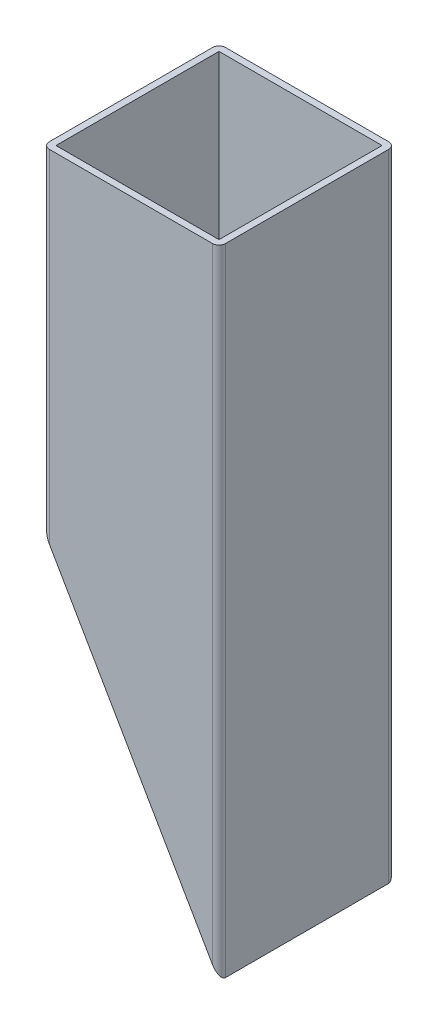
ISO-10303-21;
HEADER;
FILE_DESCRIPTION(('STEP AP214'),'2;1');
FILE_NAME('part.step','',(''),(''),'','','');
FILE_SCHEMA(('AUTOMOTIVE_DESIGN { 1 0 10303 214 1 1 1 1 }'));
ENDSEC;
DATA;
#1=APPLICATION_CONTEXT('core data for automotive mechanical design processes');
#2=APPLICATION_PROTOCOL_DEFINITION('international standard','automotive_design',2000,#1);
#3=PRODUCT_CONTEXT('',#1,'mechanical');
#4=PRODUCT('Part','Part','',(#3));
#5=PRODUCT_RELATED_PRODUCT_CATEGORY('part','',(#4));
#6=PRODUCT_DEFINITION_FORMATION('','',#4);
#7=PRODUCT_DEFINITION_CONTEXT('part definition',#1,'design');
#8=PRODUCT_DEFINITION('design','',#6,#7);
#9=PRODUCT_DEFINITION_SHAPE('','',#8);
#10=(LENGTH_UNIT() NAMED_UNIT(*) SI_UNIT(.MILLI.,.METRE.));
#11=(NAMED_UNIT(*) PLANE_ANGLE_UNIT() SI_UNIT($,.RADIAN.));
#12=(NAMED_UNIT(*) SI_UNIT($,.STERADIAN.) SOLID_ANGLE_UNIT());
#13=UNCERTAINTY_MEASURE_WITH_UNIT(LENGTH_MEASURE(1.E-05),#10,'distance_accuracy_value','');
#14=(GEOMETRIC_REPRESENTATION_CONTEXT(3) GLOBAL_UNCERTAINTY_ASSIGNED_CONTEXT((#13)) GLOBAL_UNIT_ASSIGNED_CONTEXT((#10,
#11,#12)) REPRESENTATION_CONTEXT('',''));
#15=CARTESIAN_POINT('',(0.,0.,0.));
#16=DIRECTION('',(0.,0.,1.));
#17=DIRECTION('',(1.,0.,0.));
#18=AXIS2_PLACEMENT_3D('',#15,#16,#17);
#19=CARTESIAN_POINT('',(-40.,150.,-40.01));
#20=DIRECTION('',(-0.866025403784442,-0.499999999999995,0.));
#21=DIRECTION('',(0.499999999999995,-0.866025403784442,0.));
#22=AXIS2_PLACEMENT_3D('',#19,#20,#21);
#23=PLANE('',#22);
#24=CARTESIAN_POINT('',(-37.,144.803847577293,37.));
#25=DIRECTION('',(-0.866025403784442,-0.499999999999995,0.));
#26=DIRECTION('',(0.499999999999995,-0.866025403784442,0.));
#27=AXIS2_PLACEMENT_3D('',#24,#25,#26);
#28=ELLIPSE('',#27,6.00000000000006,3.);
#29=CARTESIAN_POINT('',(-40.,150.,37.));
#30=VERTEX_POINT('',#29);
#31=CARTESIAN_POINT('',(-37.,144.803847577293,40.));
#32=VERTEX_POINT('',#31);
#33=EDGE_CURVE('E187',#30,#32,#28,.F.);
#34=ORIENTED_EDGE('',*,*,#33,.F.);
#35=DIRECTION('',(0.,0.,-1.));
#36=VECTOR('',#35,1.);
#37=CARTESIAN_POINT('',(-40.,150.,-40.0000000000001));
#38=LINE('',#37,#36);
#39=CARTESIAN_POINT('',(-40.,150.,-37.));
#40=VERTEX_POINT('',#39);
#41=EDGE_CURVE('E201',#30,#40,#38,.T.);
#42=ORIENTED_EDGE('',*,*,#41,.T.);
#43=CARTESIAN_POINT('',(-37.,144.803847577293,-37.));
#44=DIRECTION('',(-0.866025403784442,-0.499999999999995,0.));
#45=DIRECTION('',(0.499999999999995,-0.866025403784442,0.));
#46=AXIS2_PLACEMENT_3D('',#43,#44,#45);
#47=ELLIPSE('',#46,6.00000000000006,3.);
#48=CARTESIAN_POINT('',(-37.,144.803847577293,-40.));
#49=VERTEX_POINT('',#48);
#50=EDGE_CURVE('E184',#49,#40,#47,.F.);
#51=ORIENTED_EDGE('',*,*,#50,.F.);
#52=DIRECTION('',(0.499999999999995,-0.866025403784442,0.));
#53=VECTOR('',#52,1.);
#54=CARTESIAN_POINT('',(-104.951905283832,262.500000000001,-40.));
#55=LINE('',#54,#53);
#56=CARTESIAN_POINT('',(37.,16.6320878171947,-40.));
#57=VERTEX_POINT('',#56);
#58=EDGE_CURVE('E197',#49,#57,#55,.T.);
#59=ORIENTED_EDGE('',*,*,#58,.T.);
#60=CARTESIAN_POINT('',(37.,16.6320878171947,-37.));
#61=DIRECTION('',(-0.866025403784442,-0.499999999999995,0.));
#62=DIRECTION('',(0.499999999999995,-0.866025403784442,0.));
#63=AXIS2_PLACEMENT_3D('',#60,#61,#62);
#64=ELLIPSE('',#63,6.00000000000006,3.);
#65=CARTESIAN_POINT('',(40.,11.435935394488,-37.));
#66=VERTEX_POINT('',#65);
#67=EDGE_CURVE('E177',#66,#57,#64,.F.);
#68=ORIENTED_EDGE('',*,*,#67,.F.);
#69=DIRECTION('',(0.,0.,1.));
#70=VECTOR('',#69,1.);
#71=CARTESIAN_POINT('',(40.,11.435935394488,-40.0000000000001));
#72=LINE('',#71,#70);
#73=CARTESIAN_POINT('',(40.,11.435935394488,37.));
#74=VERTEX_POINT('',#73);
#75=EDGE_CURVE('E144',#66,#74,#72,.T.);
#76=ORIENTED_EDGE('',*,*,#75,.T.);
#77=CARTESIAN_POINT('',(37.,16.6320878171947,37.));
#78=DIRECTION('',(-0.866025403784442,-0.499999999999995,0.));
#79=DIRECTION('',(0.499999999999995,-0.866025403784442,0.));
#80=AXIS2_PLACEMENT_3D('',#77,#78,#79);
#81=ELLIPSE('',#80,6.00000000000006,3.);
#82=CARTESIAN_POINT('',(37.,16.6320878171947,40.));
#83=VERTEX_POINT('',#82);
#84=EDGE_CURVE('E181',#83,#74,#81,.F.);
#85=ORIENTED_EDGE('',*,*,#84,.F.);
#86=DIRECTION('',(-0.499999999999995,0.866025403784442,0.));
#87=VECTOR('',#86,1.);
#88=CARTESIAN_POINT('',(-104.951905283832,262.500000000001,40.));
#89=LINE('',#88,#87);
#90=EDGE_CURVE('E205',#83,#32,#89,.T.);
#91=ORIENTED_EDGE('',*,*,#90,.T.);
#92=EDGE_LOOP('',(#34,#42,#51,#59,#68,#76,#85,#91));
#93=FACE_BOUND('',#92,.T.);
#94=DIRECTION('',(0.,0.,1.));
#95=VECTOR('',#94,1.);
#96=CARTESIAN_POINT('',(37.,16.6320878171947,-37.0000000000002));
#97=LINE('',#96,#95);
#98=CARTESIAN_POINT('',(37.,16.6320878171946,-37.));
#99=VERTEX_POINT('',#98);
#100=CARTESIAN_POINT('',(37.,16.6320878171946,37.));
#101=VERTEX_POINT('',#100);
#102=EDGE_CURVE('E138',#99,#101,#97,.T.);
#103=ORIENTED_EDGE('',*,*,#102,.F.);
#104=DIRECTION('',(0.499999999999995,-0.866025403784442,0.));
#105=VECTOR('',#104,1.);
#106=CARTESIAN_POINT('',(-104.201905283832,261.200961894324,-37.));
#107=LINE('',#106,#105);
#108=CARTESIAN_POINT('',(-37.,144.803847577293,-37.));
#109=VERTEX_POINT('',#108);
#110=EDGE_CURVE('E129',#109,#99,#107,.T.);
#111=ORIENTED_EDGE('',*,*,#110,.F.);
#112=DIRECTION('',(0.,0.,-1.));
#113=VECTOR('',#112,1.);
#114=CARTESIAN_POINT('',(-37.,144.803847577293,-37.0000000000001));
#115=LINE('',#114,#113);
#116=CARTESIAN_POINT('',(-37.,144.803847577293,37.));
#117=VERTEX_POINT('',#116);
#118=EDGE_CURVE('E137',#117,#109,#115,.T.);
#119=ORIENTED_EDGE('',*,*,#118,.F.);
#120=DIRECTION('',(-0.499999999999995,0.866025403784442,0.));
#121=VECTOR('',#120,1.);
#122=CARTESIAN_POINT('',(-104.201905283832,261.200961894324,37.));
#123=LINE('',#122,#121);
#124=EDGE_CURVE('E141',#101,#117,#123,.T.);
#125=ORIENTED_EDGE('',*,*,#124,.F.);
#126=EDGE_LOOP('',(#103,#111,#119,#125));
#127=FACE_BOUND('',#126,.T.);
#128=ADVANCED_FACE('F39',(#93,#127),#23,.T.);
#129=CARTESIAN_POINT('',(-37.,300.,-37.));
#130=DIRECTION('',(0.,0.,1.));
#131=DIRECTION('',(1.,0.,0.));
#132=AXIS2_PLACEMENT_3D('',#129,#130,#131);
#133=PLANE('',#132);
#134=DIRECTION('',(0.,-1.,0.));
#135=VECTOR('',#134,1.);
#136=CARTESIAN_POINT('',(-37.,300.,-37.));
#137=LINE('',#136,#135);
#138=CARTESIAN_POINT('',(-37.,300.,-37.));
#139=VERTEX_POINT('',#138);
#140=EDGE_CURVE('E133',#139,#109,#137,.T.);
#141=ORIENTED_EDGE('',*,*,#140,.T.);
#142=ORIENTED_EDGE('',*,*,#110,.T.);
#143=DIRECTION('',(0.,-1.,0.));
#144=VECTOR('',#143,1.);
#145=CARTESIAN_POINT('',(37.,300.,-37.));
#146=LINE('',#145,#144);
#147=CARTESIAN_POINT('',(37.,300.,-37.));
#148=VERTEX_POINT('',#147);
#149=EDGE_CURVE('E132',#148,#99,#146,.T.);
#150=ORIENTED_EDGE('',*,*,#149,.F.);
#151=DIRECTION('',(-1.,0.,0.));
#152=VECTOR('',#151,1.);
#153=CARTESIAN_POINT('',(-37.,300.,-37.));
#154=LINE('',#153,#152);
#155=EDGE_CURVE('E49',#148,#139,#154,.T.);
#156=ORIENTED_EDGE('',*,*,#155,.T.);
#157=EDGE_LOOP('',(#141,#142,#150,#156));
#158=FACE_BOUND('',#157,.T.);
#159=ADVANCED_FACE('F131',(#158),#133,.T.);
#160=CARTESIAN_POINT('',(-40.,300.,-40.));
#161=DIRECTION('',(1.,0.,0.));
#162=DIRECTION('',(0.,0.,-1.));
#163=AXIS2_PLACEMENT_3D('',#160,#161,#162);
#164=PLANE('',#163);
#165=ORIENTED_EDGE('',*,*,#41,.F.);
#166=DIRECTION('',(0.,-1.,0.));
#167=VECTOR('',#166,1.);
#168=CARTESIAN_POINT('',(-40.,300.,37.));
#169=LINE('',#168,#167);
#170=CARTESIAN_POINT('',(-40.,300.,37.));
#171=VERTEX_POINT('',#170);
#172=EDGE_CURVE('E223',#30,#171,#169,.F.);
#173=ORIENTED_EDGE('',*,*,#172,.T.);
#174=DIRECTION('',(0.,0.,1.));
#175=VECTOR('',#174,1.);
#176=CARTESIAN_POINT('',(-40.,300.,-40.));
#177=LINE('',#176,#175);
#178=CARTESIAN_POINT('',(-40.,300.,-37.));
#179=VERTEX_POINT('',#178);
#180=EDGE_CURVE('E242',#179,#171,#177,.T.);
#181=ORIENTED_EDGE('',*,*,#180,.F.);
#182=DIRECTION('',(0.,-1.,0.));
#183=VECTOR('',#182,1.);
#184=CARTESIAN_POINT('',(-40.,300.,-37.));
#185=LINE('',#184,#183);
#186=EDGE_CURVE('E226',#179,#40,#185,.T.);
#187=ORIENTED_EDGE('',*,*,#186,.T.);
#188=EDGE_LOOP('',(#165,#173,#181,#187));
#189=FACE_BOUND('',#188,.T.);
#190=ADVANCED_FACE('F292',(#189),#164,.F.);
#191=CARTESIAN_POINT('',(0.,300.,0.));
#192=DIRECTION('',(0.,1.,0.));
#193=DIRECTION('',(0.,0.,1.));
#194=AXIS2_PLACEMENT_3D('',#191,#192,#193);
#195=PLANE('',#194);
#196=ORIENTED_EDGE('',*,*,#180,.T.);
#197=CARTESIAN_POINT('',(-37.,300.,37.));
#198=DIRECTION('',(0.,1.,0.));
#199=DIRECTION('',(0.,0.,1.));
#200=AXIS2_PLACEMENT_3D('',#197,#198,#199);
#201=CIRCLE('',#200,3.);
#202=CARTESIAN_POINT('',(-37.,300.,40.));
#203=VERTEX_POINT('',#202);
#204=EDGE_CURVE('E222',#171,#203,#201,.T.);
#205=ORIENTED_EDGE('',*,*,#204,.T.);
#206=DIRECTION('',(1.,0.,0.));
#207=VECTOR('',#206,1.);
#208=CARTESIAN_POINT('',(-40.,300.,40.));
#209=LINE('',#208,#207);
#210=CARTESIAN_POINT('',(37.,300.,40.));
#211=VERTEX_POINT('',#210);
#212=EDGE_CURVE('E238',#203,#211,#209,.T.);
#213=ORIENTED_EDGE('',*,*,#212,.T.);
#214=CARTESIAN_POINT('',(37.,300.,37.));
#215=DIRECTION('',(0.,1.,0.));
#216=DIRECTION('',(0.,0.,1.));
#217=AXIS2_PLACEMENT_3D('',#214,#215,#216);
#218=CIRCLE('',#217,3.);
#219=CARTESIAN_POINT('',(40.,300.,37.));
#220=VERTEX_POINT('',#219);
#221=EDGE_CURVE('E267',#211,#220,#218,.T.);
#222=ORIENTED_EDGE('',*,*,#221,.T.);
#223=DIRECTION('',(0.,0.,-1.));
#224=VECTOR('',#223,1.);
#225=CARTESIAN_POINT('',(40.,300.,-40.));
#226=LINE('',#225,#224);
#227=CARTESIAN_POINT('',(40.,300.,-37.));
#228=VERTEX_POINT('',#227);
#229=EDGE_CURVE('E148',#220,#228,#226,.T.);
#230=ORIENTED_EDGE('',*,*,#229,.T.);
#231=CARTESIAN_POINT('',(37.,300.,-37.));
#232=DIRECTION('',(0.,1.,0.));
#233=DIRECTION('',(0.,0.,1.));
#234=AXIS2_PLACEMENT_3D('',#231,#232,#233);
#235=CIRCLE('',#234,3.);
#236=CARTESIAN_POINT('',(37.,300.,-40.));
#237=VERTEX_POINT('',#236);
#238=EDGE_CURVE('E227',#228,#237,#235,.T.);
#239=ORIENTED_EDGE('',*,*,#238,.T.);
#240=DIRECTION('',(-1.,0.,0.));
#241=VECTOR('',#240,1.);
#242=CARTESIAN_POINT('',(-40.,300.,-40.));
#243=LINE('',#242,#241);
#244=CARTESIAN_POINT('',(-37.,300.,-40.));
#245=VERTEX_POINT('',#244);
#246=EDGE_CURVE('E155',#237,#245,#243,.T.);
#247=ORIENTED_EDGE('',*,*,#246,.T.);
#248=CARTESIAN_POINT('',(-37.,300.,-37.));
#249=DIRECTION('',(0.,1.,0.));
#250=DIRECTION('',(0.,0.,1.));
#251=AXIS2_PLACEMENT_3D('',#248,#249,#250);
#252=CIRCLE('',#251,3.);
#253=EDGE_CURVE('E257',#245,#179,#252,.T.);
#254=ORIENTED_EDGE('',*,*,#253,.T.);
#255=EDGE_LOOP('',(#196,#205,#213,#222,#230,#239,#247,#254));
#256=FACE_BOUND('',#255,.T.);
#257=ORIENTED_EDGE('',*,*,#155,.F.);
#258=DIRECTION('',(0.,0.,-1.));
#259=VECTOR('',#258,1.);
#260=CARTESIAN_POINT('',(37.,300.,-37.));
#261=LINE('',#260,#259);
#262=CARTESIAN_POINT('',(37.,300.,37.));
#263=VERTEX_POINT('',#262);
#264=EDGE_CURVE('E11',#263,#148,#261,.T.);
#265=ORIENTED_EDGE('',*,*,#264,.F.);
#266=DIRECTION('',(1.,0.,0.));
#267=VECTOR('',#266,1.);
#268=CARTESIAN_POINT('',(-37.,300.,37.));
#269=LINE('',#268,#267);
#270=CARTESIAN_POINT('',(-37.,300.,37.));
#271=VERTEX_POINT('',#270);
#272=EDGE_CURVE('E165',#271,#263,#269,.T.);
#273=ORIENTED_EDGE('',*,*,#272,.F.);
#274=DIRECTION('',(0.,0.,1.));
#275=VECTOR('',#274,1.);
#276=CARTESIAN_POINT('',(-37.,300.,-37.));
#277=LINE('',#276,#275);
#278=EDGE_CURVE('E168',#139,#271,#277,.T.);
#279=ORIENTED_EDGE('',*,*,#278,.F.);
#280=EDGE_LOOP('',(#257,#265,#273,#279));
#281=FACE_BOUND('',#280,.T.);
#282=ADVANCED_FACE('F255',(#256,#281),#195,.T.);
#283=CARTESIAN_POINT('',(-40.,300.,-40.));
#284=DIRECTION('',(0.,0.,1.));
#285=DIRECTION('',(1.,0.,0.));
#286=AXIS2_PLACEMENT_3D('',#283,#284,#285);
#287=PLANE('',#286);
#288=ORIENTED_EDGE('',*,*,#58,.F.);
#289=DIRECTION('',(0.,-1.,0.));
#290=VECTOR('',#289,1.);
#291=CARTESIAN_POINT('',(-37.,300.,-40.));
#292=LINE('',#291,#290);
#293=EDGE_CURVE('E215',#49,#245,#292,.F.);
#294=ORIENTED_EDGE('',*,*,#293,.T.);
#295=ORIENTED_EDGE('',*,*,#246,.F.);
#296=DIRECTION('',(0.,-1.,0.));
#297=VECTOR('',#296,1.);
#298=CARTESIAN_POINT('',(37.,300.,-40.));
#299=LINE('',#298,#297);
#300=EDGE_CURVE('E218',#237,#57,#299,.T.);
#301=ORIENTED_EDGE('',*,*,#300,.T.);
#302=EDGE_LOOP('',(#288,#294,#295,#301));
#303=FACE_BOUND('',#302,.T.);
#304=ADVANCED_FACE('F290',(#303),#287,.F.);
#305=CARTESIAN_POINT('',(40.,300.,-40.));
#306=DIRECTION('',(-1.,0.,0.));
#307=DIRECTION('',(0.,0.,1.));
#308=AXIS2_PLACEMENT_3D('',#305,#306,#307);
#309=PLANE('',#308);
#310=ORIENTED_EDGE('',*,*,#75,.F.);
#311=DIRECTION('',(0.,-1.,0.));
#312=VECTOR('',#311,1.);
#313=CARTESIAN_POINT('',(40.,300.,-37.));
#314=LINE('',#313,#312);
#315=EDGE_CURVE('E212',#66,#228,#314,.F.);
#316=ORIENTED_EDGE('',*,*,#315,.T.);
#317=ORIENTED_EDGE('',*,*,#229,.F.);
#318=DIRECTION('',(0.,-1.,0.));
#319=VECTOR('',#318,1.);
#320=CARTESIAN_POINT('',(40.,300.,37.));
#321=LINE('',#320,#319);
#322=EDGE_CURVE('E180',#220,#74,#321,.T.);
#323=ORIENTED_EDGE('',*,*,#322,.T.);
#324=EDGE_LOOP('',(#310,#316,#317,#323));
#325=FACE_BOUND('',#324,.T.);
#326=ADVANCED_FACE('F285',(#325),#309,.F.);
#327=CARTESIAN_POINT('',(37.,300.,-37.));
#328=DIRECTION('',(0.,-1.,0.));
#329=DIRECTION('',(0.,0.,-1.));
#330=AXIS2_PLACEMENT_3D('',#327,#328,#329);
#331=CYLINDRICAL_SURFACE('',#330,3.);
#332=ORIENTED_EDGE('',*,*,#315,.F.);
#333=ORIENTED_EDGE('',*,*,#67,.T.);
#334=ORIENTED_EDGE('',*,*,#300,.F.);
#335=ORIENTED_EDGE('',*,*,#238,.F.);
#336=EDGE_LOOP('',(#332,#333,#334,#335));
#337=FACE_BOUND('',#336,.T.);
#338=ADVANCED_FACE('F41',(#337),#331,.T.);
#339=CARTESIAN_POINT('',(-40.,300.,40.));
#340=DIRECTION('',(0.,0.,-1.));
#341=DIRECTION('',(-1.,0.,0.));
#342=AXIS2_PLACEMENT_3D('',#339,#340,#341);
#343=PLANE('',#342);
#344=ORIENTED_EDGE('',*,*,#90,.F.);
#345=DIRECTION('',(0.,-1.,0.));
#346=VECTOR('',#345,1.);
#347=CARTESIAN_POINT('',(37.,300.,40.));
#348=LINE('',#347,#346);
#349=EDGE_CURVE('E158',#83,#211,#348,.F.);
#350=ORIENTED_EDGE('',*,*,#349,.T.);
#351=ORIENTED_EDGE('',*,*,#212,.F.);
#352=DIRECTION('',(0.,-1.,0.));
#353=VECTOR('',#352,1.);
#354=CARTESIAN_POINT('',(-37.,300.,40.));
#355=LINE('',#354,#353);
#356=EDGE_CURVE('E230',#203,#32,#355,.T.);
#357=ORIENTED_EDGE('',*,*,#356,.T.);
#358=EDGE_LOOP('',(#344,#350,#351,#357));
#359=FACE_BOUND('',#358,.T.);
#360=ADVANCED_FACE('F275',(#359),#343,.F.);
#361=CARTESIAN_POINT('',(37.,300.,37.));
#362=DIRECTION('',(0.,-1.,0.));
#363=DIRECTION('',(0.,0.,-1.));
#364=AXIS2_PLACEMENT_3D('',#361,#362,#363);
#365=CYLINDRICAL_SURFACE('',#364,3.);
#366=ORIENTED_EDGE('',*,*,#349,.F.);
#367=ORIENTED_EDGE('',*,*,#84,.T.);
#368=ORIENTED_EDGE('',*,*,#322,.F.);
#369=ORIENTED_EDGE('',*,*,#221,.F.);
#370=EDGE_LOOP('',(#366,#367,#368,#369));
#371=FACE_BOUND('',#370,.T.);
#372=ADVANCED_FACE('F280',(#371),#365,.T.);
#373=CARTESIAN_POINT('',(-37.,300.,-37.));
#374=DIRECTION('',(0.,-1.,0.));
#375=DIRECTION('',(0.,0.,-1.));
#376=AXIS2_PLACEMENT_3D('',#373,#374,#375);
#377=CYLINDRICAL_SURFACE('',#376,3.);
#378=ORIENTED_EDGE('',*,*,#293,.F.);
#379=ORIENTED_EDGE('',*,*,#50,.T.);
#380=ORIENTED_EDGE('',*,*,#186,.F.);
#381=ORIENTED_EDGE('',*,*,#253,.F.);
#382=EDGE_LOOP('',(#378,#379,#380,#381));
#383=FACE_BOUND('',#382,.T.);
#384=ADVANCED_FACE('F265',(#383),#377,.T.);
#385=CARTESIAN_POINT('',(-37.,300.,37.));
#386=DIRECTION('',(0.,-1.,0.));
#387=DIRECTION('',(0.,0.,-1.));
#388=AXIS2_PLACEMENT_3D('',#385,#386,#387);
#389=CYLINDRICAL_SURFACE('',#388,3.);
#390=ORIENTED_EDGE('',*,*,#172,.F.);
#391=ORIENTED_EDGE('',*,*,#33,.T.);
#392=ORIENTED_EDGE('',*,*,#356,.F.);
#393=ORIENTED_EDGE('',*,*,#204,.F.);
#394=EDGE_LOOP('',(#390,#391,#392,#393));
#395=FACE_BOUND('',#394,.T.);
#396=ADVANCED_FACE('F276',(#395),#389,.T.);
#397=CARTESIAN_POINT('',(-37.,300.,-37.));
#398=DIRECTION('',(1.,0.,0.));
#399=DIRECTION('',(0.,0.,-1.));
#400=AXIS2_PLACEMENT_3D('',#397,#398,#399);
#401=PLANE('',#400);
#402=DIRECTION('',(0.,-1.,0.));
#403=VECTOR('',#402,1.);
#404=CARTESIAN_POINT('',(-37.,300.,37.));
#405=LINE('',#404,#403);
#406=EDGE_CURVE('E152',#271,#117,#405,.T.);
#407=ORIENTED_EDGE('',*,*,#406,.T.);
#408=ORIENTED_EDGE('',*,*,#118,.T.);
#409=ORIENTED_EDGE('',*,*,#140,.F.);
#410=ORIENTED_EDGE('',*,*,#278,.T.);
#411=EDGE_LOOP('',(#407,#408,#409,#410));
#412=FACE_BOUND('',#411,.T.);
#413=ADVANCED_FACE('F308',(#412),#401,.T.);
#414=CARTESIAN_POINT('',(37.,300.,-37.));
#415=DIRECTION('',(-1.,0.,0.));
#416=DIRECTION('',(0.,0.,1.));
#417=AXIS2_PLACEMENT_3D('',#414,#415,#416);
#418=PLANE('',#417);
#419=ORIENTED_EDGE('',*,*,#149,.T.);
#420=ORIENTED_EDGE('',*,*,#102,.T.);
#421=DIRECTION('',(0.,-1.,0.));
#422=VECTOR('',#421,1.);
#423=CARTESIAN_POINT('',(37.,300.,37.));
#424=LINE('',#423,#422);
#425=EDGE_CURVE('E43',#263,#101,#424,.T.);
#426=ORIENTED_EDGE('',*,*,#425,.F.);
#427=ORIENTED_EDGE('',*,*,#264,.T.);
#428=EDGE_LOOP('',(#419,#420,#426,#427));
#429=FACE_BOUND('',#428,.T.);
#430=ADVANCED_FACE('F146',(#429),#418,.T.);
#431=CARTESIAN_POINT('',(-37.,300.,37.));
#432=DIRECTION('',(0.,0.,-1.));
#433=DIRECTION('',(-1.,0.,0.));
#434=AXIS2_PLACEMENT_3D('',#431,#432,#433);
#435=PLANE('',#434);
#436=ORIENTED_EDGE('',*,*,#425,.T.);
#437=ORIENTED_EDGE('',*,*,#124,.T.);
#438=ORIENTED_EDGE('',*,*,#406,.F.);
#439=ORIENTED_EDGE('',*,*,#272,.T.);
#440=EDGE_LOOP('',(#436,#437,#438,#439));
#441=FACE_BOUND('',#440,.T.);
#442=ADVANCED_FACE('F307',(#441),#435,.T.);
#443=CLOSED_SHELL('',(#128,#159,#190,#282,#304,#326,#338,#360,#372,#384,#396,#413,#430,#442));
#444=MANIFOLD_SOLID_BREP('B2',#443);
#445=ADVANCED_BREP_SHAPE_REPRESENTATION('',(#18,#444),#14);
#446=SHAPE_DEFINITION_REPRESENTATION(#9,#445);
ENDSEC;
END-ISO-10303-21;
